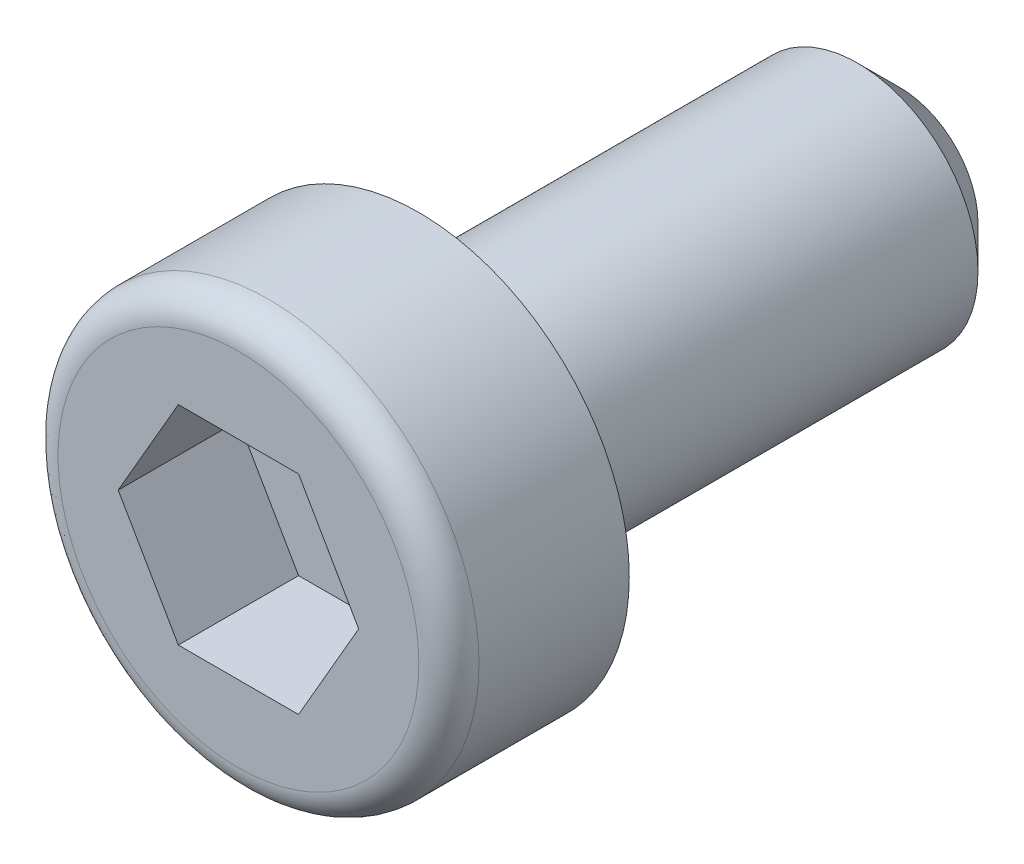
ISO-10303-21;
HEADER;
FILE_DESCRIPTION(('STEP AP214'),'2;1');
FILE_NAME('part.step','',(''),(''),'','','');
FILE_SCHEMA(('AUTOMOTIVE_DESIGN { 1 0 10303 214 1 1 1 1 }'));
ENDSEC;
DATA;
#1=APPLICATION_CONTEXT('core data for automotive mechanical design processes');
#2=APPLICATION_PROTOCOL_DEFINITION('international standard','automotive_design',2000,#1);
#3=PRODUCT_CONTEXT('',#1,'mechanical');
#4=PRODUCT('Part','Part','',(#3));
#5=PRODUCT_RELATED_PRODUCT_CATEGORY('part','',(#4));
#6=PRODUCT_DEFINITION_FORMATION('','',#4);
#7=PRODUCT_DEFINITION_CONTEXT('part definition',#1,'design');
#8=PRODUCT_DEFINITION('design','',#6,#7);
#9=PRODUCT_DEFINITION_SHAPE('','',#8);
#10=(LENGTH_UNIT() NAMED_UNIT(*) SI_UNIT(.MILLI.,.METRE.));
#11=(NAMED_UNIT(*) PLANE_ANGLE_UNIT() SI_UNIT($,.RADIAN.));
#12=(NAMED_UNIT(*) SI_UNIT($,.STERADIAN.) SOLID_ANGLE_UNIT());
#13=UNCERTAINTY_MEASURE_WITH_UNIT(LENGTH_MEASURE(1.E-05),#10,'distance_accuracy_value','');
#14=(GEOMETRIC_REPRESENTATION_CONTEXT(3) GLOBAL_UNCERTAINTY_ASSIGNED_CONTEXT((#13)) GLOBAL_UNIT_ASSIGNED_CONTEXT((#10,
#11,#12)) REPRESENTATION_CONTEXT('',''));
#15=CARTESIAN_POINT('',(0.,0.,0.));
#16=DIRECTION('',(0.,0.,1.));
#17=DIRECTION('',(1.,0.,0.));
#18=AXIS2_PLACEMENT_3D('',#15,#16,#17);
#19=CARTESIAN_POINT('',(2.,-1.7320508075689,1.));
#20=DIRECTION('',(0.,0.,-1.));
#21=DIRECTION('',(-1.,0.,0.));
#22=AXIS2_PLACEMENT_3D('',#19,#20,#21);
#23=PLANE('',#22);
#24=DIRECTION('',(-0.499999999999995,0.866025403784441,0.));
#25=VECTOR('',#24,1.);
#26=CARTESIAN_POINT('',(1.5,0.86602540378445,1.));
#27=LINE('',#26,#25);
#28=CARTESIAN_POINT('',(1.99999999942265,9.99990360157389E-10,1.));
#29=VERTEX_POINT('',#28);
#30=CARTESIAN_POINT('',(1.,1.73205080756889,1.));
#31=VERTEX_POINT('',#30);
#32=EDGE_CURVE('E78',#29,#31,#27,.T.);
#33=ORIENTED_EDGE('',*,*,#32,.T.);
#34=DIRECTION('',(-1.,0.,0.));
#35=VECTOR('',#34,1.);
#36=CARTESIAN_POINT('',(0.,1.7320508075689,1.));
#37=LINE('',#36,#35);
#38=CARTESIAN_POINT('',(-1.,1.73205080756888,1.));
#39=VERTEX_POINT('',#38);
#40=EDGE_CURVE('E107',#31,#39,#37,.T.);
#41=ORIENTED_EDGE('',*,*,#40,.T.);
#42=DIRECTION('',(-0.499999999999995,-0.866025403784441,0.));
#43=VECTOR('',#42,1.);
#44=CARTESIAN_POINT('',(-1.5,0.86602540378445,1.));
#45=LINE('',#44,#43);
#46=CARTESIAN_POINT('',(-1.99999999942265,-1.00000987579649E-09,1.));
#47=VERTEX_POINT('',#46);
#48=EDGE_CURVE('E61',#39,#47,#45,.T.);
#49=ORIENTED_EDGE('',*,*,#48,.T.);
#50=DIRECTION('',(0.499999999999995,-0.866025403784441,0.));
#51=VECTOR('',#50,1.);
#52=CARTESIAN_POINT('',(-1.5,-0.86602540378445,1.));
#53=LINE('',#52,#51);
#54=CARTESIAN_POINT('',(-1.,-1.7320508075689,1.));
#55=VERTEX_POINT('',#54);
#56=EDGE_CURVE('E102',#47,#55,#53,.T.);
#57=ORIENTED_EDGE('',*,*,#56,.T.);
#58=DIRECTION('',(1.,0.,0.));
#59=VECTOR('',#58,1.);
#60=CARTESIAN_POINT('',(0.,-1.7320508075689,1.));
#61=LINE('',#60,#59);
#62=CARTESIAN_POINT('',(1.,-1.7320508075689,1.));
#63=VERTEX_POINT('',#62);
#64=EDGE_CURVE('E94',#55,#63,#61,.T.);
#65=ORIENTED_EDGE('',*,*,#64,.T.);
#66=DIRECTION('',(0.499999999999995,0.866025403784441,0.));
#67=VECTOR('',#66,1.);
#68=CARTESIAN_POINT('',(1.5,-0.86602540378445,1.));
#69=LINE('',#68,#67);
#70=EDGE_CURVE('E87',#63,#29,#69,.T.);
#71=ORIENTED_EDGE('',*,*,#70,.T.);
#72=EDGE_LOOP('',(#33,#41,#49,#57,#65,#71));
#73=FACE_BOUND('',#72,.T.);
#74=ADVANCED_FACE('F17',(#73),#23,.F.);
#75=CARTESIAN_POINT('',(2.,0.,3.));
#76=DIRECTION('',(0.866025403784441,0.499999999999995,0.));
#77=DIRECTION('',(0.,0.,-1.));
#78=AXIS2_PLACEMENT_3D('',#75,#76,#77);
#79=PLANE('',#78);
#80=DIRECTION('',(0.,0.,-1.));
#81=VECTOR('',#80,1.);
#82=CARTESIAN_POINT('',(1.,1.7320508075689,2.));
#83=LINE('',#82,#81);
#84=CARTESIAN_POINT('',(1.00000000000001,1.73205080756888,3.));
#85=VERTEX_POINT('',#84);
#86=EDGE_CURVE('E55',#85,#31,#83,.T.);
#87=ORIENTED_EDGE('',*,*,#86,.T.);
#88=ORIENTED_EDGE('',*,*,#32,.F.);
#89=DIRECTION('',(0.,0.,1.));
#90=VECTOR('',#89,1.);
#91=CARTESIAN_POINT('',(2.,0.,2.));
#92=LINE('',#91,#90);
#93=CARTESIAN_POINT('',(1.99999999999999,0.,3.));
#94=VERTEX_POINT('',#93);
#95=EDGE_CURVE('E82',#29,#94,#92,.T.);
#96=ORIENTED_EDGE('',*,*,#95,.T.);
#97=DIRECTION('',(0.499999999999988,-0.866025403784445,0.));
#98=VECTOR('',#97,1.);
#99=CARTESIAN_POINT('',(1.00000000000002,1.73205080756886,3.));
#100=LINE('',#99,#98);
#101=EDGE_CURVE('E21',#85,#94,#100,.T.);
#102=ORIENTED_EDGE('',*,*,#101,.F.);
#103=EDGE_LOOP('',(#87,#88,#96,#102));
#104=FACE_BOUND('',#103,.T.);
#105=ADVANCED_FACE('F80',(#104),#79,.F.);
#106=CARTESIAN_POINT('',(1.,-1.7320508075689,3.));
#107=DIRECTION('',(0.866025403784441,-0.499999999999995,0.));
#108=DIRECTION('',(0.,0.,-1.));
#109=AXIS2_PLACEMENT_3D('',#106,#107,#108);
#110=PLANE('',#109);
#111=ORIENTED_EDGE('',*,*,#95,.F.);
#112=ORIENTED_EDGE('',*,*,#70,.F.);
#113=DIRECTION('',(0.,0.,1.));
#114=VECTOR('',#113,1.);
#115=CARTESIAN_POINT('',(1.,-1.7320508075689,2.));
#116=LINE('',#115,#114);
#117=CARTESIAN_POINT('',(1.00000000000001,-1.73205080756888,3.));
#118=VERTEX_POINT('',#117);
#119=EDGE_CURVE('E101',#63,#118,#116,.T.);
#120=ORIENTED_EDGE('',*,*,#119,.T.);
#121=DIRECTION('',(-0.499999999999989,-0.866025403784445,0.));
#122=VECTOR('',#121,1.);
#123=CARTESIAN_POINT('',(1.99999999999998,0.,3.));
#124=LINE('',#123,#122);
#125=EDGE_CURVE('E93',#94,#118,#124,.T.);
#126=ORIENTED_EDGE('',*,*,#125,.F.);
#127=EDGE_LOOP('',(#111,#112,#120,#126));
#128=FACE_BOUND('',#127,.T.);
#129=ADVANCED_FACE('F90',(#128),#110,.F.);
#130=CARTESIAN_POINT('',(-1.,-1.7320508075689,3.));
#131=DIRECTION('',(0.,-1.,0.));
#132=DIRECTION('',(0.,0.,-1.));
#133=AXIS2_PLACEMENT_3D('',#130,#131,#132);
#134=PLANE('',#133);
#135=ORIENTED_EDGE('',*,*,#119,.F.);
#136=ORIENTED_EDGE('',*,*,#64,.F.);
#137=DIRECTION('',(0.,0.,1.));
#138=VECTOR('',#137,1.);
#139=CARTESIAN_POINT('',(-1.,-1.7320508075689,2.));
#140=LINE('',#139,#138);
#141=CARTESIAN_POINT('',(-1.00000000000001,-1.73205080756888,3.));
#142=VERTEX_POINT('',#141);
#143=EDGE_CURVE('E104',#55,#142,#140,.T.);
#144=ORIENTED_EDGE('',*,*,#143,.T.);
#145=DIRECTION('',(-1.,0.,0.));
#146=VECTOR('',#145,1.);
#147=CARTESIAN_POINT('',(0.,-1.73205080756886,3.));
#148=LINE('',#147,#146);
#149=EDGE_CURVE('E206',#118,#142,#148,.T.);
#150=ORIENTED_EDGE('',*,*,#149,.F.);
#151=EDGE_LOOP('',(#135,#136,#144,#150));
#152=FACE_BOUND('',#151,.T.);
#153=ADVANCED_FACE('F187',(#152),#134,.F.);
#154=CARTESIAN_POINT('',(-2.,0.,3.));
#155=DIRECTION('',(-0.866025403784441,-0.499999999999995,0.));
#156=DIRECTION('',(0.,0.,-1.));
#157=AXIS2_PLACEMENT_3D('',#154,#155,#156);
#158=PLANE('',#157);
#159=ORIENTED_EDGE('',*,*,#143,.F.);
#160=ORIENTED_EDGE('',*,*,#56,.F.);
#161=DIRECTION('',(0.,0.,1.));
#162=VECTOR('',#161,1.);
#163=CARTESIAN_POINT('',(-2.,0.,2.));
#164=LINE('',#163,#162);
#165=CARTESIAN_POINT('',(-1.99999999999999,0.,3.));
#166=VERTEX_POINT('',#165);
#167=EDGE_CURVE('E106',#47,#166,#164,.T.);
#168=ORIENTED_EDGE('',*,*,#167,.T.);
#169=DIRECTION('',(-0.499999999999989,0.866025403784445,0.));
#170=VECTOR('',#169,1.);
#171=CARTESIAN_POINT('',(-1.00000000000002,-1.73205080756886,3.));
#172=LINE('',#171,#170);
#173=EDGE_CURVE('E208',#142,#166,#172,.T.);
#174=ORIENTED_EDGE('',*,*,#173,.F.);
#175=EDGE_LOOP('',(#159,#160,#168,#174));
#176=FACE_BOUND('',#175,.T.);
#177=ADVANCED_FACE('F190',(#176),#158,.F.);
#178=CARTESIAN_POINT('',(-1.,1.7320508075689,3.));
#179=DIRECTION('',(-0.866025403784441,0.499999999999995,0.));
#180=DIRECTION('',(0.,0.,-1.));
#181=AXIS2_PLACEMENT_3D('',#178,#179,#180);
#182=PLANE('',#181);
#183=ORIENTED_EDGE('',*,*,#167,.F.);
#184=ORIENTED_EDGE('',*,*,#48,.F.);
#185=DIRECTION('',(0.,0.,1.));
#186=VECTOR('',#185,1.);
#187=CARTESIAN_POINT('',(-1.,1.7320508075689,2.));
#188=LINE('',#187,#186);
#189=CARTESIAN_POINT('',(-1.00000000000001,1.73205080756888,3.));
#190=VERTEX_POINT('',#189);
#191=EDGE_CURVE('E109',#39,#190,#188,.T.);
#192=ORIENTED_EDGE('',*,*,#191,.T.);
#193=DIRECTION('',(0.499999999999988,0.866025403784445,0.));
#194=VECTOR('',#193,1.);
#195=CARTESIAN_POINT('',(-1.99999999999998,0.,3.));
#196=LINE('',#195,#194);
#197=EDGE_CURVE('E36',#166,#190,#196,.T.);
#198=ORIENTED_EDGE('',*,*,#197,.F.);
#199=EDGE_LOOP('',(#183,#184,#192,#198));
#200=FACE_BOUND('',#199,.T.);
#201=ADVANCED_FACE('F193',(#200),#182,.F.);
#202=CARTESIAN_POINT('',(1.,1.7320508075689,3.));
#203=DIRECTION('',(0.,1.,0.));
#204=DIRECTION('',(0.,0.,-1.));
#205=AXIS2_PLACEMENT_3D('',#202,#203,#204);
#206=PLANE('',#205);
#207=ORIENTED_EDGE('',*,*,#191,.F.);
#208=ORIENTED_EDGE('',*,*,#40,.F.);
#209=ORIENTED_EDGE('',*,*,#86,.F.);
#210=DIRECTION('',(1.,0.,0.));
#211=VECTOR('',#210,1.);
#212=CARTESIAN_POINT('',(0.,1.73205080756886,3.));
#213=LINE('',#212,#211);
#214=EDGE_CURVE('E201',#190,#85,#213,.T.);
#215=ORIENTED_EDGE('',*,*,#214,.F.);
#216=EDGE_LOOP('',(#207,#208,#209,#215));
#217=FACE_BOUND('',#216,.T.);
#218=ADVANCED_FACE('F159',(#217),#206,.F.);
#219=CARTESIAN_POINT('',(-3.,-3.,3.));
#220=DIRECTION('',(0.,0.,1.));
#221=DIRECTION('',(1.,0.,0.));
#222=AXIS2_PLACEMENT_3D('',#219,#220,#221);
#223=PLANE('',#222);
#224=ORIENTED_EDGE('',*,*,#197,.T.);
#225=ORIENTED_EDGE('',*,*,#214,.T.);
#226=ORIENTED_EDGE('',*,*,#101,.T.);
#227=ORIENTED_EDGE('',*,*,#125,.T.);
#228=ORIENTED_EDGE('',*,*,#149,.T.);
#229=ORIENTED_EDGE('',*,*,#173,.T.);
#230=EDGE_LOOP('',(#224,#225,#226,#227,#228,#229));
#231=FACE_BOUND('',#230,.T.);
#232=CARTESIAN_POINT('',(0.,0.,3.));
#233=DIRECTION('',(0.,0.,-1.));
#234=DIRECTION('',(1.,0.,0.));
#235=AXIS2_PLACEMENT_3D('',#232,#233,#234);
#236=CIRCLE('',#235,3.);
#237=CARTESIAN_POINT('',(3.,0.,3.));
#238=VERTEX_POINT('',#237);
#239=EDGE_CURVE('E145',#238,#238,#236,.T.);
#240=ORIENTED_EDGE('',*,*,#239,.F.);
#241=EDGE_LOOP('',(#240));
#242=FACE_BOUND('',#241,.T.);
#243=ADVANCED_FACE('F125',(#231,#242),#223,.T.);
#244=CARTESIAN_POINT('',(3.,0.,3.));
#245=CARTESIAN_POINT('',(3.5,0.,3.));
#246=CARTESIAN_POINT('',(3.5,0.,2.5));
#247=CARTESIAN_POINT('',(3.5,0.,2.));
#248=CARTESIAN_POINT('',(3.,0.,2.));
#249=(BOUNDED_CURVE() B_SPLINE_CURVE(2,(#244,#245,#246,#247,#248),.UNSPECIFIED.,.F.,
.F.) B_SPLINE_CURVE_WITH_KNOTS((3,2,3),(0.,0.25,0.5),
.UNSPECIFIED.) CURVE() GEOMETRIC_REPRESENTATION_ITEM() RATIONAL_B_SPLINE_CURVE((1.,
0.70710678118655,1.,0.70710678118655,1.)) REPRESENTATION_ITEM(''));
#250=CARTESIAN_POINT('',(0.,0.,2.));
#251=DIRECTION('',(0.,0.,1.));
#252=AXIS1_PLACEMENT('',#250,#251);
#253=SURFACE_OF_REVOLUTION('',#249,#252);
#254=CARTESIAN_POINT('',(0.,0.,2.5));
#255=DIRECTION('',(0.,0.,1.));
#256=DIRECTION('',(1.,0.,0.));
#257=AXIS2_PLACEMENT_3D('',#254,#255,#256);
#258=CIRCLE('',#257,3.5);
#259=CARTESIAN_POINT('',(3.5,0.,2.5));
#260=VERTEX_POINT('',#259);
#261=EDGE_CURVE('E219',#260,#260,#258,.T.);
#262=ORIENTED_EDGE('',*,*,#261,.T.);
#263=EDGE_LOOP('',(#262));
#264=FACE_BOUND('',#263,.T.);
#265=ORIENTED_EDGE('',*,*,#239,.T.);
#266=EDGE_LOOP('',(#265));
#267=FACE_BOUND('',#266,.T.);
#268=ADVANCED_FACE('F120',(#264,#267),#253,.F.);
#269=CARTESIAN_POINT('',(1.3,-1.3,-8.));
#270=DIRECTION('',(0.,0.,-1.));
#271=DIRECTION('',(-1.,0.,0.));
#272=AXIS2_PLACEMENT_3D('',#269,#270,#271);
#273=PLANE('',#272);
#274=CARTESIAN_POINT('',(0.,0.,-8.));
#275=DIRECTION('',(0.,0.,1.));
#276=DIRECTION('',(1.,0.,0.));
#277=AXIS2_PLACEMENT_3D('',#274,#275,#276);
#278=CIRCLE('',#277,1.3);
#279=CARTESIAN_POINT('',(1.3,0.,-8.));
#280=VERTEX_POINT('',#279);
#281=EDGE_CURVE('E215',#280,#280,#278,.F.);
#282=ORIENTED_EDGE('',*,*,#281,.T.);
#283=EDGE_LOOP('',(#282));
#284=FACE_BOUND('',#283,.T.);
#285=ADVANCED_FACE('F124',(#284),#273,.T.);
#286=CARTESIAN_POINT('',(0.,0.,0.));
#287=DIRECTION('',(0.,0.,1.));
#288=DIRECTION('',(1.,0.,0.));
#289=AXIS2_PLACEMENT_3D('',#286,#287,#288);
#290=CYLINDRICAL_SURFACE('',#289,3.5);
#291=CARTESIAN_POINT('',(0.,0.,0.));
#292=DIRECTION('',(0.,0.,1.));
#293=DIRECTION('',(1.,0.,0.));
#294=AXIS2_PLACEMENT_3D('',#291,#292,#293);
#295=CIRCLE('',#294,3.5);
#296=CARTESIAN_POINT('',(3.5,0.,0.));
#297=VERTEX_POINT('',#296);
#298=EDGE_CURVE('E139',#297,#297,#295,.F.);
#299=ORIENTED_EDGE('',*,*,#298,.F.);
#300=EDGE_LOOP('',(#299));
#301=FACE_BOUND('',#300,.T.);
#302=ORIENTED_EDGE('',*,*,#261,.F.);
#303=EDGE_LOOP('',(#302));
#304=FACE_BOUND('',#303,.T.);
#305=ADVANCED_FACE('F127',(#301,#304),#290,.T.);
#306=CARTESIAN_POINT('',(0.,0.,-8.));
#307=DIRECTION('',(0.,0.,1.));
#308=DIRECTION('',(1.,0.,0.));
#309=AXIS2_PLACEMENT_3D('',#306,#307,#308);
#310=CONICAL_SURFACE('',#309,1.3,0.785398163397448);
#311=ORIENTED_EDGE('',*,*,#281,.F.);
#312=EDGE_LOOP('',(#311));
#313=FACE_BOUND('',#312,.T.);
#314=CARTESIAN_POINT('',(0.,0.,-7.3));
#315=DIRECTION('',(0.,0.,1.));
#316=DIRECTION('',(1.,0.,0.));
#317=AXIS2_PLACEMENT_3D('',#314,#315,#316);
#318=CIRCLE('',#317,2.);
#319=CARTESIAN_POINT('',(2.,0.,-7.3));
#320=VERTEX_POINT('',#319);
#321=EDGE_CURVE('E27',#320,#320,#318,.F.);
#322=ORIENTED_EDGE('',*,*,#321,.T.);
#323=EDGE_LOOP('',(#322));
#324=FACE_BOUND('',#323,.T.);
#325=ADVANCED_FACE('F167',(#313,#324),#310,.T.);
#326=CARTESIAN_POINT('',(3.5,-3.5,0.));
#327=DIRECTION('',(0.,0.,-1.));
#328=DIRECTION('',(-1.,0.,0.));
#329=AXIS2_PLACEMENT_3D('',#326,#327,#328);
#330=PLANE('',#329);
#331=CARTESIAN_POINT('',(0.,0.,0.));
#332=DIRECTION('',(0.,0.,1.));
#333=DIRECTION('',(1.,0.,0.));
#334=AXIS2_PLACEMENT_3D('',#331,#332,#333);
#335=CIRCLE('',#334,2.);
#336=CARTESIAN_POINT('',(2.,0.,0.));
#337=VERTEX_POINT('',#336);
#338=EDGE_CURVE('E11',#337,#337,#335,.T.);
#339=ORIENTED_EDGE('',*,*,#338,.T.);
#340=EDGE_LOOP('',(#339));
#341=FACE_BOUND('',#340,.T.);
#342=ORIENTED_EDGE('',*,*,#298,.T.);
#343=EDGE_LOOP('',(#342));
#344=FACE_BOUND('',#343,.T.);
#345=ADVANCED_FACE('F19',(#341,#344),#330,.T.);
#346=CARTESIAN_POINT('',(0.,0.,-7.3));
#347=DIRECTION('',(0.,0.,1.));
#348=DIRECTION('',(1.,0.,0.));
#349=AXIS2_PLACEMENT_3D('',#346,#347,#348);
#350=CYLINDRICAL_SURFACE('',#349,2.);
#351=ORIENTED_EDGE('',*,*,#321,.F.);
#352=EDGE_LOOP('',(#351));
#353=FACE_BOUND('',#352,.T.);
#354=ORIENTED_EDGE('',*,*,#338,.F.);
#355=EDGE_LOOP('',(#354));
#356=FACE_BOUND('',#355,.T.);
#357=ADVANCED_FACE('F170',(#353,#356),#350,.T.);
#358=CLOSED_SHELL('',(#74,#105,#129,#153,#177,#201,#218,#243,#268,#285,#305,#325,#345,#357));
#359=MANIFOLD_SOLID_BREP('B1',#358);
#360=ADVANCED_BREP_SHAPE_REPRESENTATION('',(#18,#359),#14);
#361=SHAPE_DEFINITION_REPRESENTATION(#9,#360);
ENDSEC;
END-ISO-10303-21;
